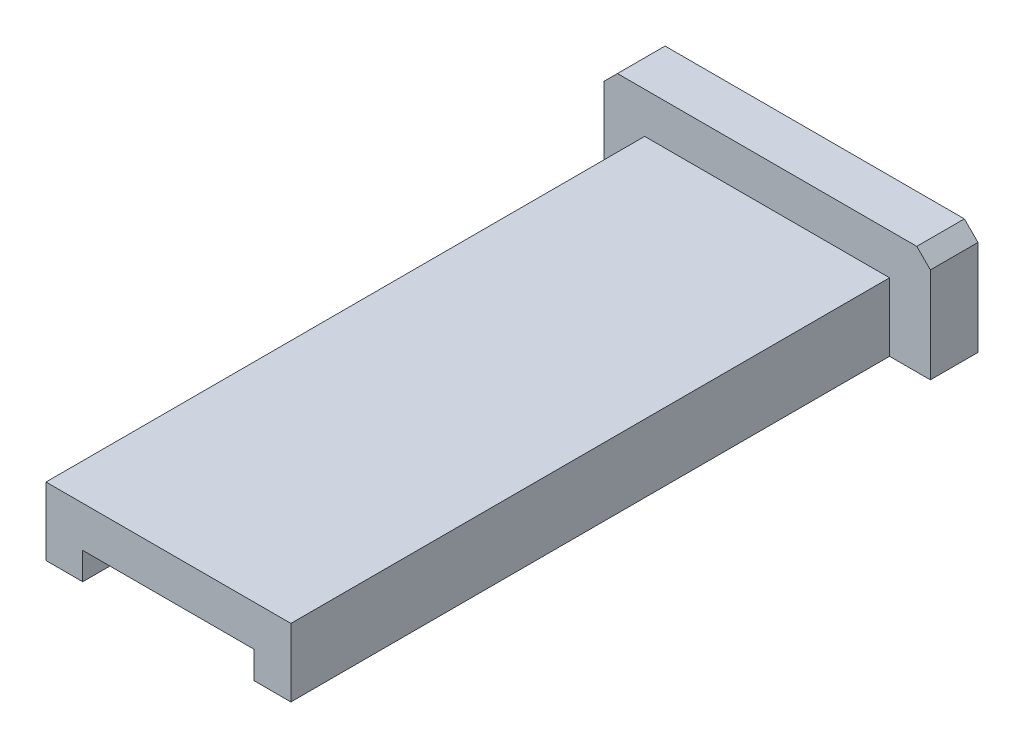
ISO-10303-21;
HEADER;
FILE_DESCRIPTION(('STEP AP214'),'2;1');
FILE_NAME('part.step','',(''),(''),'','','');
FILE_SCHEMA(('AUTOMOTIVE_DESIGN { 1 0 10303 214 1 1 1 1 }'));
ENDSEC;
DATA;
#1=APPLICATION_CONTEXT('core data for automotive mechanical design processes');
#2=APPLICATION_PROTOCOL_DEFINITION('international standard','automotive_design',2000,#1);
#3=PRODUCT_CONTEXT('',#1,'mechanical');
#4=PRODUCT('Part','Part','',(#3));
#5=PRODUCT_RELATED_PRODUCT_CATEGORY('part','',(#4));
#6=PRODUCT_DEFINITION_FORMATION('','',#4);
#7=PRODUCT_DEFINITION_CONTEXT('part definition',#1,'design');
#8=PRODUCT_DEFINITION('design','',#6,#7);
#9=PRODUCT_DEFINITION_SHAPE('','',#8);
#10=(LENGTH_UNIT() NAMED_UNIT(*) SI_UNIT(.MILLI.,.METRE.));
#11=(NAMED_UNIT(*) PLANE_ANGLE_UNIT() SI_UNIT($,.RADIAN.));
#12=(NAMED_UNIT(*) SI_UNIT($,.STERADIAN.) SOLID_ANGLE_UNIT());
#13=UNCERTAINTY_MEASURE_WITH_UNIT(LENGTH_MEASURE(1.E-05),#10,'distance_accuracy_value','');
#14=(GEOMETRIC_REPRESENTATION_CONTEXT(3) GLOBAL_UNCERTAINTY_ASSIGNED_CONTEXT((#13)) GLOBAL_UNIT_ASSIGNED_CONTEXT((#10,
#11,#12)) REPRESENTATION_CONTEXT('',''));
#15=CARTESIAN_POINT('',(0.,0.,0.));
#16=DIRECTION('',(0.,0.,1.));
#17=DIRECTION('',(1.,0.,0.));
#18=AXIS2_PLACEMENT_3D('',#15,#16,#17);
#19=CARTESIAN_POINT('',(-9.,-2.5,47.5));
#20=DIRECTION('',(0.,1.,0.));
#21=DIRECTION('',(0.,0.,1.));
#22=AXIS2_PLACEMENT_3D('',#19,#20,#21);
#23=PLANE('',#22);
#24=DIRECTION('',(1.,0.,0.));
#25=VECTOR('',#24,1.);
#26=CARTESIAN_POINT('',(-9.,-2.5,47.5));
#27=LINE('',#26,#25);
#28=CARTESIAN_POINT('',(6.3,-2.5,47.5));
#29=VERTEX_POINT('',#28);
#30=CARTESIAN_POINT('',(9.,-2.5,47.5));
#31=VERTEX_POINT('',#30);
#32=EDGE_CURVE('E159',#29,#31,#27,.T.);
#33=ORIENTED_EDGE('',*,*,#32,.F.);
#34=DIRECTION('',(0.,0.,-1.));
#35=VECTOR('',#34,1.);
#36=CARTESIAN_POINT('',(6.3,-2.5,47.5));
#37=LINE('',#36,#35);
#38=CARTESIAN_POINT('',(6.3,-2.5,0.));
#39=VERTEX_POINT('',#38);
#40=EDGE_CURVE('E142',#29,#39,#37,.T.);
#41=ORIENTED_EDGE('',*,*,#40,.T.);
#42=DIRECTION('',(1.,0.,0.));
#43=VECTOR('',#42,1.);
#44=CARTESIAN_POINT('',(-9.,-2.5,0.));
#45=LINE('',#44,#43);
#46=CARTESIAN_POINT('',(12.,-2.5,0.));
#47=VERTEX_POINT('',#46);
#48=EDGE_CURVE('E181',#39,#47,#45,.T.);
#49=ORIENTED_EDGE('',*,*,#48,.T.);
#50=DIRECTION('',(0.,0.,-1.));
#51=VECTOR('',#50,1.);
#52=CARTESIAN_POINT('',(12.,-2.5,3.5));
#53=LINE('',#52,#51);
#54=CARTESIAN_POINT('',(12.,-2.5,3.5));
#55=VERTEX_POINT('',#54);
#56=EDGE_CURVE('E215',#55,#47,#53,.T.);
#57=ORIENTED_EDGE('',*,*,#56,.F.);
#58=DIRECTION('',(-1.,0.,0.));
#59=VECTOR('',#58,1.);
#60=CARTESIAN_POINT('',(12.,-2.5,3.5));
#61=LINE('',#60,#59);
#62=CARTESIAN_POINT('',(9.,-2.5,3.5));
#63=VERTEX_POINT('',#62);
#64=EDGE_CURVE('E275',#55,#63,#61,.T.);
#65=ORIENTED_EDGE('',*,*,#64,.T.);
#66=DIRECTION('',(0.,0.,-1.));
#67=VECTOR('',#66,1.);
#68=CARTESIAN_POINT('',(9.,-2.5,47.5));
#69=LINE('',#68,#67);
#70=EDGE_CURVE('E167',#31,#63,#69,.T.);
#71=ORIENTED_EDGE('',*,*,#70,.F.);
#72=EDGE_LOOP('',(#33,#41,#49,#57,#65,#71));
#73=FACE_BOUND('',#72,.T.);
#74=ADVANCED_FACE('F37',(#73),#23,.F.);
#75=CARTESIAN_POINT('',(9.,-2.5,47.5));
#76=DIRECTION('',(-1.,0.,0.));
#77=DIRECTION('',(0.,0.,1.));
#78=AXIS2_PLACEMENT_3D('',#75,#76,#77);
#79=PLANE('',#78);
#80=ORIENTED_EDGE('',*,*,#70,.T.);
#81=DIRECTION('',(0.,1.,0.));
#82=VECTOR('',#81,1.);
#83=CARTESIAN_POINT('',(9.,-2.5,3.5));
#84=LINE('',#83,#82);
#85=CARTESIAN_POINT('',(9.,2.5,3.5));
#86=VERTEX_POINT('',#85);
#87=EDGE_CURVE('E244',#63,#86,#84,.T.);
#88=ORIENTED_EDGE('',*,*,#87,.T.);
#89=DIRECTION('',(0.,0.,-1.));
#90=VECTOR('',#89,1.);
#91=CARTESIAN_POINT('',(9.,2.5,47.5));
#92=LINE('',#91,#90);
#93=CARTESIAN_POINT('',(9.,2.5,47.5));
#94=VERTEX_POINT('',#93);
#95=EDGE_CURVE('E189',#94,#86,#92,.T.);
#96=ORIENTED_EDGE('',*,*,#95,.F.);
#97=DIRECTION('',(0.,1.,0.));
#98=VECTOR('',#97,1.);
#99=CARTESIAN_POINT('',(9.,-2.5,47.5));
#100=LINE('',#99,#98);
#101=EDGE_CURVE('E180',#31,#94,#100,.T.);
#102=ORIENTED_EDGE('',*,*,#101,.F.);
#103=EDGE_LOOP('',(#80,#88,#96,#102));
#104=FACE_BOUND('',#103,.T.);
#105=ADVANCED_FACE('F298',(#104),#79,.F.);
#106=CARTESIAN_POINT('',(-9.,2.5,47.5));
#107=DIRECTION('',(0.,-1.,0.));
#108=DIRECTION('',(0.,0.,-1.));
#109=AXIS2_PLACEMENT_3D('',#106,#107,#108);
#110=PLANE('',#109);
#111=ORIENTED_EDGE('',*,*,#95,.T.);
#112=DIRECTION('',(-1.,0.,0.));
#113=VECTOR('',#112,1.);
#114=CARTESIAN_POINT('',(-9.,2.5,3.5));
#115=LINE('',#114,#113);
#116=CARTESIAN_POINT('',(-9.,2.5,3.5));
#117=VERTEX_POINT('',#116);
#118=EDGE_CURVE('E242',#86,#117,#115,.T.);
#119=ORIENTED_EDGE('',*,*,#118,.T.);
#120=DIRECTION('',(0.,0.,-1.));
#121=VECTOR('',#120,1.);
#122=CARTESIAN_POINT('',(-9.,2.5,47.5));
#123=LINE('',#122,#121);
#124=CARTESIAN_POINT('',(-9.,2.5,47.5));
#125=VERTEX_POINT('',#124);
#126=EDGE_CURVE('E186',#125,#117,#123,.T.);
#127=ORIENTED_EDGE('',*,*,#126,.F.);
#128=DIRECTION('',(-1.,0.,0.));
#129=VECTOR('',#128,1.);
#130=CARTESIAN_POINT('',(-9.,2.5,47.5));
#131=LINE('',#130,#129);
#132=EDGE_CURVE('E173',#94,#125,#131,.T.);
#133=ORIENTED_EDGE('',*,*,#132,.F.);
#134=EDGE_LOOP('',(#111,#119,#127,#133));
#135=FACE_BOUND('',#134,.T.);
#136=ADVANCED_FACE('F251',(#135),#110,.F.);
#137=CARTESIAN_POINT('',(-9.,-2.5,47.5));
#138=DIRECTION('',(1.,0.,0.));
#139=DIRECTION('',(0.,0.,-1.));
#140=AXIS2_PLACEMENT_3D('',#137,#138,#139);
#141=PLANE('',#140);
#142=ORIENTED_EDGE('',*,*,#126,.T.);
#143=DIRECTION('',(0.,-1.,0.));
#144=VECTOR('',#143,1.);
#145=CARTESIAN_POINT('',(-9.,-2.5,3.5));
#146=LINE('',#145,#144);
#147=CARTESIAN_POINT('',(-9.,-2.5,3.5));
#148=VERTEX_POINT('',#147);
#149=EDGE_CURVE('E239',#117,#148,#146,.T.);
#150=ORIENTED_EDGE('',*,*,#149,.T.);
#151=DIRECTION('',(0.,0.,-1.));
#152=VECTOR('',#151,1.);
#153=CARTESIAN_POINT('',(-9.,-2.5,47.5));
#154=LINE('',#153,#152);
#155=CARTESIAN_POINT('',(-9.,-2.5,47.5));
#156=VERTEX_POINT('',#155);
#157=EDGE_CURVE('E183',#156,#148,#154,.T.);
#158=ORIENTED_EDGE('',*,*,#157,.F.);
#159=DIRECTION('',(0.,-1.,0.));
#160=VECTOR('',#159,1.);
#161=CARTESIAN_POINT('',(-9.,-2.5,47.5));
#162=LINE('',#161,#160);
#163=EDGE_CURVE('E170',#125,#156,#162,.T.);
#164=ORIENTED_EDGE('',*,*,#163,.F.);
#165=EDGE_LOOP('',(#142,#150,#158,#164));
#166=FACE_BOUND('',#165,.T.);
#167=ADVANCED_FACE('F255',(#166),#141,.F.);
#168=CARTESIAN_POINT('',(-12.,-2.5,0.));
#169=VERTEX_POINT('',#168);
#170=CARTESIAN_POINT('',(-6.3,-2.5,0.));
#171=VERTEX_POINT('',#170);
#172=EDGE_CURVE('E177',#169,#171,#45,.T.);
#173=ORIENTED_EDGE('',*,*,#172,.T.);
#174=DIRECTION('',(0.,0.,-1.));
#175=VECTOR('',#174,1.);
#176=CARTESIAN_POINT('',(-6.3,-2.5,47.5));
#177=LINE('',#176,#175);
#178=CARTESIAN_POINT('',(-6.3,-2.5,47.5));
#179=VERTEX_POINT('',#178);
#180=EDGE_CURVE('E153',#179,#171,#177,.T.);
#181=ORIENTED_EDGE('',*,*,#180,.F.);
#182=EDGE_CURVE('E169',#156,#179,#27,.T.);
#183=ORIENTED_EDGE('',*,*,#182,.F.);
#184=ORIENTED_EDGE('',*,*,#157,.T.);
#185=CARTESIAN_POINT('',(-12.,-2.5,3.5));
#186=VERTEX_POINT('',#185);
#187=EDGE_CURVE('E274',#148,#186,#61,.T.);
#188=ORIENTED_EDGE('',*,*,#187,.T.);
#189=DIRECTION('',(0.,0.,-1.));
#190=VECTOR('',#189,1.);
#191=CARTESIAN_POINT('',(-12.,-2.5,3.5));
#192=LINE('',#191,#190);
#193=EDGE_CURVE('E236',#186,#169,#192,.T.);
#194=ORIENTED_EDGE('',*,*,#193,.T.);
#195=EDGE_LOOP('',(#173,#181,#183,#184,#188,#194));
#196=FACE_BOUND('',#195,.T.);
#197=ADVANCED_FACE('F260',(#196),#23,.F.);
#198=CARTESIAN_POINT('',(0.,0.,47.5));
#199=DIRECTION('',(0.,0.,-1.));
#200=DIRECTION('',(-1.,0.,0.));
#201=AXIS2_PLACEMENT_3D('',#198,#199,#200);
#202=PLANE('',#201);
#203=DIRECTION('',(1.,0.,0.));
#204=VECTOR('',#203,1.);
#205=CARTESIAN_POINT('',(6.3,-0.5,47.5));
#206=LINE('',#205,#204);
#207=CARTESIAN_POINT('',(-6.3,-0.5,47.5));
#208=VERTEX_POINT('',#207);
#209=CARTESIAN_POINT('',(6.3,-0.5,47.5));
#210=VERTEX_POINT('',#209);
#211=EDGE_CURVE('E154',#208,#210,#206,.T.);
#212=ORIENTED_EDGE('',*,*,#211,.T.);
#213=DIRECTION('',(0.,-1.,0.));
#214=VECTOR('',#213,1.);
#215=CARTESIAN_POINT('',(6.3,-2.5,47.5));
#216=LINE('',#215,#214);
#217=EDGE_CURVE('E145',#210,#29,#216,.T.);
#218=ORIENTED_EDGE('',*,*,#217,.T.);
#219=ORIENTED_EDGE('',*,*,#32,.T.);
#220=ORIENTED_EDGE('',*,*,#101,.T.);
#221=ORIENTED_EDGE('',*,*,#132,.T.);
#222=ORIENTED_EDGE('',*,*,#163,.T.);
#223=ORIENTED_EDGE('',*,*,#182,.T.);
#224=DIRECTION('',(0.,1.,0.));
#225=VECTOR('',#224,1.);
#226=CARTESIAN_POINT('',(-6.3,-2.5,47.5));
#227=LINE('',#226,#225);
#228=EDGE_CURVE('E163',#179,#208,#227,.T.);
#229=ORIENTED_EDGE('',*,*,#228,.T.);
#230=EDGE_LOOP('',(#212,#218,#219,#220,#221,#222,#223,#229));
#231=FACE_BOUND('',#230,.T.);
#232=ADVANCED_FACE('F157',(#231),#202,.F.);
#233=CARTESIAN_POINT('',(0.,0.,0.));
#234=DIRECTION('',(0.,0.,-1.));
#235=DIRECTION('',(-1.,0.,0.));
#236=AXIS2_PLACEMENT_3D('',#233,#234,#235);
#237=PLANE('',#236);
#238=DIRECTION('',(1.,0.,0.));
#239=VECTOR('',#238,1.);
#240=CARTESIAN_POINT('',(12.,5.5,0.));
#241=LINE('',#240,#239);
#242=CARTESIAN_POINT('',(-11.,5.5,0.));
#243=VERTEX_POINT('',#242);
#244=CARTESIAN_POINT('',(11.,5.5,0.));
#245=VERTEX_POINT('',#244);
#246=EDGE_CURVE('E222',#243,#245,#241,.T.);
#247=ORIENTED_EDGE('',*,*,#246,.T.);
#248=DIRECTION('',(-0.707106781186548,0.707106781186548,0.));
#249=VECTOR('',#248,1.);
#250=CARTESIAN_POINT('',(8.25,8.25,0.));
#251=LINE('',#250,#249);
#252=CARTESIAN_POINT('',(12.,4.5,0.));
#253=VERTEX_POINT('',#252);
#254=EDGE_CURVE('E199',#245,#253,#251,.F.);
#255=ORIENTED_EDGE('',*,*,#254,.T.);
#256=DIRECTION('',(0.,-1.,0.));
#257=VECTOR('',#256,1.);
#258=CARTESIAN_POINT('',(12.,-2.5,0.));
#259=LINE('',#258,#257);
#260=EDGE_CURVE('E221',#253,#47,#259,.T.);
#261=ORIENTED_EDGE('',*,*,#260,.T.);
#262=ORIENTED_EDGE('',*,*,#48,.F.);
#263=DIRECTION('',(0.,-1.,0.));
#264=VECTOR('',#263,1.);
#265=CARTESIAN_POINT('',(6.3,-2.5,0.));
#266=LINE('',#265,#264);
#267=CARTESIAN_POINT('',(6.3,-0.5,0.));
#268=VERTEX_POINT('',#267);
#269=EDGE_CURVE('E148',#268,#39,#266,.T.);
#270=ORIENTED_EDGE('',*,*,#269,.F.);
#271=DIRECTION('',(1.,0.,0.));
#272=VECTOR('',#271,1.);
#273=CARTESIAN_POINT('',(6.3,-0.5,0.));
#274=LINE('',#273,#272);
#275=CARTESIAN_POINT('',(-6.3,-0.5,0.));
#276=VERTEX_POINT('',#275);
#277=EDGE_CURVE('E164',#276,#268,#274,.T.);
#278=ORIENTED_EDGE('',*,*,#277,.F.);
#279=DIRECTION('',(0.,1.,0.));
#280=VECTOR('',#279,1.);
#281=CARTESIAN_POINT('',(-6.3,-2.5,0.));
#282=LINE('',#281,#280);
#283=EDGE_CURVE('E266',#171,#276,#282,.T.);
#284=ORIENTED_EDGE('',*,*,#283,.F.);
#285=ORIENTED_EDGE('',*,*,#172,.F.);
#286=DIRECTION('',(0.,1.,0.));
#287=VECTOR('',#286,1.);
#288=CARTESIAN_POINT('',(-12.,-2.5,0.));
#289=LINE('',#288,#287);
#290=CARTESIAN_POINT('',(-12.,4.50000000000001,0.));
#291=VERTEX_POINT('',#290);
#292=EDGE_CURVE('E226',#169,#291,#289,.T.);
#293=ORIENTED_EDGE('',*,*,#292,.T.);
#294=DIRECTION('',(-0.70710678118655,-0.707106781186545,0.));
#295=VECTOR('',#294,1.);
#296=CARTESIAN_POINT('',(-8.24999999999996,8.25000000000002,0.));
#297=LINE('',#296,#295);
#298=EDGE_CURVE('E197',#291,#243,#297,.F.);
#299=ORIENTED_EDGE('',*,*,#298,.T.);
#300=EDGE_LOOP('',(#247,#255,#261,#262,#270,#278,#284,#285,#293,#299));
#301=FACE_BOUND('',#300,.T.);
#302=ADVANCED_FACE('F220',(#301),#237,.T.);
#303=CARTESIAN_POINT('',(0.,0.,3.5));
#304=DIRECTION('',(0.,0.,1.));
#305=DIRECTION('',(1.,0.,0.));
#306=AXIS2_PLACEMENT_3D('',#303,#304,#305);
#307=PLANE('',#306);
#308=DIRECTION('',(0.,-1.,0.));
#309=VECTOR('',#308,1.);
#310=CARTESIAN_POINT('',(12.,-2.5,3.5));
#311=LINE('',#310,#309);
#312=CARTESIAN_POINT('',(12.,4.5,3.5));
#313=VERTEX_POINT('',#312);
#314=EDGE_CURVE('E207',#313,#55,#311,.T.);
#315=ORIENTED_EDGE('',*,*,#314,.F.);
#316=DIRECTION('',(0.707106781186548,-0.707106781186548,0.));
#317=VECTOR('',#316,1.);
#318=CARTESIAN_POINT('',(8.25,8.25,3.5));
#319=LINE('',#318,#317);
#320=CARTESIAN_POINT('',(11.,5.5,3.5));
#321=VERTEX_POINT('',#320);
#322=EDGE_CURVE('E46',#313,#321,#319,.F.);
#323=ORIENTED_EDGE('',*,*,#322,.T.);
#324=DIRECTION('',(1.,0.,0.));
#325=VECTOR('',#324,1.);
#326=CARTESIAN_POINT('',(12.,5.5,3.5));
#327=LINE('',#326,#325);
#328=CARTESIAN_POINT('',(-11.,5.5,3.5));
#329=VERTEX_POINT('',#328);
#330=EDGE_CURVE('E205',#329,#321,#327,.T.);
#331=ORIENTED_EDGE('',*,*,#330,.F.);
#332=DIRECTION('',(0.70710678118655,0.707106781186545,0.));
#333=VECTOR('',#332,1.);
#334=CARTESIAN_POINT('',(-8.24999999999996,8.25000000000002,3.5));
#335=LINE('',#334,#333);
#336=CARTESIAN_POINT('',(-12.,4.50000000000001,3.5));
#337=VERTEX_POINT('',#336);
#338=EDGE_CURVE('E53',#329,#337,#335,.F.);
#339=ORIENTED_EDGE('',*,*,#338,.T.);
#340=DIRECTION('',(0.,1.,0.));
#341=VECTOR('',#340,1.);
#342=CARTESIAN_POINT('',(-12.,-2.5,3.5));
#343=LINE('',#342,#341);
#344=EDGE_CURVE('E216',#186,#337,#343,.T.);
#345=ORIENTED_EDGE('',*,*,#344,.F.);
#346=ORIENTED_EDGE('',*,*,#187,.F.);
#347=ORIENTED_EDGE('',*,*,#149,.F.);
#348=ORIENTED_EDGE('',*,*,#118,.F.);
#349=ORIENTED_EDGE('',*,*,#87,.F.);
#350=ORIENTED_EDGE('',*,*,#64,.F.);
#351=EDGE_LOOP('',(#315,#323,#331,#339,#345,#346,#347,#348,#349,#350));
#352=FACE_BOUND('',#351,.T.);
#353=ADVANCED_FACE('F204',(#352),#307,.T.);
#354=CARTESIAN_POINT('',(12.,-2.5,3.5));
#355=DIRECTION('',(1.,0.,0.));
#356=DIRECTION('',(0.,0.,-1.));
#357=AXIS2_PLACEMENT_3D('',#354,#355,#356);
#358=PLANE('',#357);
#359=ORIENTED_EDGE('',*,*,#260,.F.);
#360=DIRECTION('',(0.,0.,1.));
#361=VECTOR('',#360,1.);
#362=CARTESIAN_POINT('',(12.,4.5,3.5));
#363=LINE('',#362,#361);
#364=EDGE_CURVE('E61',#253,#313,#363,.T.);
#365=ORIENTED_EDGE('',*,*,#364,.T.);
#366=ORIENTED_EDGE('',*,*,#314,.T.);
#367=ORIENTED_EDGE('',*,*,#56,.T.);
#368=EDGE_LOOP('',(#359,#365,#366,#367));
#369=FACE_BOUND('',#368,.T.);
#370=ADVANCED_FACE('F224',(#369),#358,.T.);
#371=CARTESIAN_POINT('',(12.,5.5,3.5));
#372=DIRECTION('',(0.,1.,0.));
#373=DIRECTION('',(0.,0.,1.));
#374=AXIS2_PLACEMENT_3D('',#371,#372,#373);
#375=PLANE('',#374);
#376=ORIENTED_EDGE('',*,*,#330,.T.);
#377=DIRECTION('',(0.,0.,-1.));
#378=VECTOR('',#377,1.);
#379=CARTESIAN_POINT('',(11.,5.5,3.5));
#380=LINE('',#379,#378);
#381=EDGE_CURVE('E194',#321,#245,#380,.T.);
#382=ORIENTED_EDGE('',*,*,#381,.T.);
#383=ORIENTED_EDGE('',*,*,#246,.F.);
#384=DIRECTION('',(0.,0.,1.));
#385=VECTOR('',#384,1.);
#386=CARTESIAN_POINT('',(-11.,5.5,3.5));
#387=LINE('',#386,#385);
#388=EDGE_CURVE('E192',#243,#329,#387,.T.);
#389=ORIENTED_EDGE('',*,*,#388,.T.);
#390=EDGE_LOOP('',(#376,#382,#383,#389));
#391=FACE_BOUND('',#390,.T.);
#392=ADVANCED_FACE('F211',(#391),#375,.T.);
#393=CARTESIAN_POINT('',(-12.,-2.5,3.5));
#394=DIRECTION('',(-1.,0.,0.));
#395=DIRECTION('',(0.,0.,1.));
#396=AXIS2_PLACEMENT_3D('',#393,#394,#395);
#397=PLANE('',#396);
#398=ORIENTED_EDGE('',*,*,#344,.T.);
#399=DIRECTION('',(0.,0.,-1.));
#400=VECTOR('',#399,1.);
#401=CARTESIAN_POINT('',(-12.,4.50000000000001,3.5));
#402=LINE('',#401,#400);
#403=EDGE_CURVE('E11',#337,#291,#402,.T.);
#404=ORIENTED_EDGE('',*,*,#403,.T.);
#405=ORIENTED_EDGE('',*,*,#292,.F.);
#406=ORIENTED_EDGE('',*,*,#193,.F.);
#407=EDGE_LOOP('',(#398,#404,#405,#406));
#408=FACE_BOUND('',#407,.T.);
#409=ADVANCED_FACE('F279',(#408),#397,.T.);
#410=CARTESIAN_POINT('',(6.3,-2.5,47.5));
#411=DIRECTION('',(1.,0.,0.));
#412=DIRECTION('',(0.,0.,-1.));
#413=AXIS2_PLACEMENT_3D('',#410,#411,#412);
#414=PLANE('',#413);
#415=ORIENTED_EDGE('',*,*,#269,.T.);
#416=ORIENTED_EDGE('',*,*,#40,.F.);
#417=ORIENTED_EDGE('',*,*,#217,.F.);
#418=DIRECTION('',(0.,0.,-1.));
#419=VECTOR('',#418,1.);
#420=CARTESIAN_POINT('',(6.3,-0.5,47.5));
#421=LINE('',#420,#419);
#422=EDGE_CURVE('E227',#210,#268,#421,.T.);
#423=ORIENTED_EDGE('',*,*,#422,.T.);
#424=EDGE_LOOP('',(#415,#416,#417,#423));
#425=FACE_BOUND('',#424,.T.);
#426=ADVANCED_FACE('F144',(#425),#414,.F.);
#427=CARTESIAN_POINT('',(6.3,-0.5,47.5));
#428=DIRECTION('',(0.,1.,0.));
#429=DIRECTION('',(0.,0.,1.));
#430=AXIS2_PLACEMENT_3D('',#427,#428,#429);
#431=PLANE('',#430);
#432=ORIENTED_EDGE('',*,*,#277,.T.);
#433=ORIENTED_EDGE('',*,*,#422,.F.);
#434=ORIENTED_EDGE('',*,*,#211,.F.);
#435=DIRECTION('',(0.,0.,-1.));
#436=VECTOR('',#435,1.);
#437=CARTESIAN_POINT('',(-6.3,-0.5,47.5));
#438=LINE('',#437,#436);
#439=EDGE_CURVE('E231',#208,#276,#438,.T.);
#440=ORIENTED_EDGE('',*,*,#439,.T.);
#441=EDGE_LOOP('',(#432,#433,#434,#440));
#442=FACE_BOUND('',#441,.T.);
#443=ADVANCED_FACE('F287',(#442),#431,.F.);
#444=CARTESIAN_POINT('',(-6.3,-2.5,47.5));
#445=DIRECTION('',(-1.,0.,0.));
#446=DIRECTION('',(0.,0.,1.));
#447=AXIS2_PLACEMENT_3D('',#444,#445,#446);
#448=PLANE('',#447);
#449=ORIENTED_EDGE('',*,*,#283,.T.);
#450=ORIENTED_EDGE('',*,*,#439,.F.);
#451=ORIENTED_EDGE('',*,*,#228,.F.);
#452=ORIENTED_EDGE('',*,*,#180,.T.);
#453=EDGE_LOOP('',(#449,#450,#451,#452));
#454=FACE_BOUND('',#453,.T.);
#455=ADVANCED_FACE('F288',(#454),#448,.F.);
#456=CARTESIAN_POINT('',(11.,5.5,3.5));
#457=DIRECTION('',(-0.707106781186547,-0.707106781186547,0.));
#458=DIRECTION('',(0.,0.,-1.));
#459=AXIS2_PLACEMENT_3D('',#456,#457,#458);
#460=PLANE('',#459);
#461=ORIENTED_EDGE('',*,*,#322,.F.);
#462=ORIENTED_EDGE('',*,*,#364,.F.);
#463=ORIENTED_EDGE('',*,*,#254,.F.);
#464=ORIENTED_EDGE('',*,*,#381,.F.);
#465=EDGE_LOOP('',(#461,#462,#463,#464));
#466=FACE_BOUND('',#465,.T.);
#467=ADVANCED_FACE('F218',(#466),#460,.F.);
#468=CARTESIAN_POINT('',(-12.,4.50000000000001,3.5));
#469=DIRECTION('',(0.707106781186545,-0.70710678118655,0.));
#470=DIRECTION('',(0.,0.,-1.));
#471=AXIS2_PLACEMENT_3D('',#468,#469,#470);
#472=PLANE('',#471);
#473=ORIENTED_EDGE('',*,*,#338,.F.);
#474=ORIENTED_EDGE('',*,*,#388,.F.);
#475=ORIENTED_EDGE('',*,*,#298,.F.);
#476=ORIENTED_EDGE('',*,*,#403,.F.);
#477=EDGE_LOOP('',(#473,#474,#475,#476));
#478=FACE_BOUND('',#477,.T.);
#479=ADVANCED_FACE('F40',(#478),#472,.F.);
#480=CLOSED_SHELL('',(#74,#105,#136,#167,#197,#232,#302,#353,#370,#392,#409,#426,#443,#455,#467,#479));
#481=MANIFOLD_SOLID_BREP('B2',#480);
#482=ADVANCED_BREP_SHAPE_REPRESENTATION('',(#18,#481),#14);
#483=SHAPE_DEFINITION_REPRESENTATION(#9,#482);
ENDSEC;
END-ISO-10303-21;
